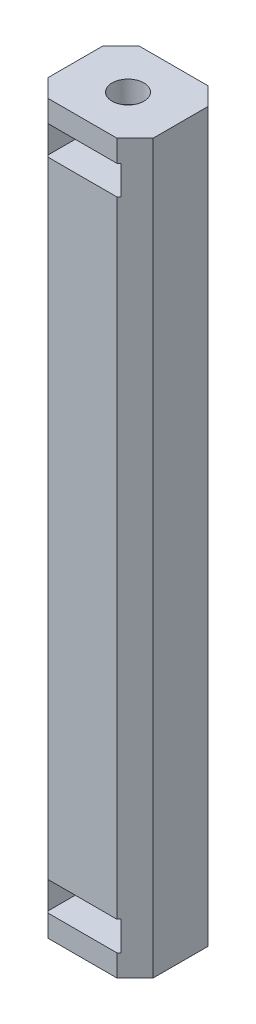
ISO-10303-21;
HEADER;
FILE_DESCRIPTION(('STEP AP214'),'2;1');
FILE_NAME('part.step','',(''),(''),'','','');
FILE_SCHEMA(('AUTOMOTIVE_DESIGN { 1 0 10303 214 1 1 1 1 }'));
ENDSEC;
DATA;
#1=APPLICATION_CONTEXT('core data for automotive mechanical design processes');
#2=APPLICATION_PROTOCOL_DEFINITION('international standard','automotive_design',2000,#1);
#3=PRODUCT_CONTEXT('',#1,'mechanical');
#4=PRODUCT('Part','Part','',(#3));
#5=PRODUCT_RELATED_PRODUCT_CATEGORY('part','',(#4));
#6=PRODUCT_DEFINITION_FORMATION('','',#4);
#7=PRODUCT_DEFINITION_CONTEXT('part definition',#1,'design');
#8=PRODUCT_DEFINITION('design','',#6,#7);
#9=PRODUCT_DEFINITION_SHAPE('','',#8);
#10=(LENGTH_UNIT() NAMED_UNIT(*) SI_UNIT(.MILLI.,.METRE.));
#11=(NAMED_UNIT(*) PLANE_ANGLE_UNIT() SI_UNIT($,.RADIAN.));
#12=(NAMED_UNIT(*) SI_UNIT($,.STERADIAN.) SOLID_ANGLE_UNIT());
#13=UNCERTAINTY_MEASURE_WITH_UNIT(LENGTH_MEASURE(1.E-05),#10,'distance_accuracy_value','');
#14=(GEOMETRIC_REPRESENTATION_CONTEXT(3) GLOBAL_UNCERTAINTY_ASSIGNED_CONTEXT((#13)) GLOBAL_UNIT_ASSIGNED_CONTEXT((#10,
#11,#12)) REPRESENTATION_CONTEXT('',''));
#15=CARTESIAN_POINT('',(0.,0.,0.));
#16=DIRECTION('',(0.,0.,1.));
#17=DIRECTION('',(1.,0.,0.));
#18=AXIS2_PLACEMENT_3D('',#15,#16,#17);
#19=CARTESIAN_POINT('',(-2.88675134594812,40.,2.5));
#20=DIRECTION('',(0.,0.,-1.));
#21=DIRECTION('',(-1.,0.,0.));
#22=AXIS2_PLACEMENT_3D('',#19,#20,#21);
#23=PLANE('',#22);
#24=DIRECTION('',(1.,0.,0.));
#25=VECTOR('',#24,1.);
#26=CARTESIAN_POINT('',(-2.88675134594812,40.,2.5));
#27=LINE('',#26,#25);
#28=CARTESIAN_POINT('',(-1.88675134594812,40.,2.5));
#29=VERTEX_POINT('',#28);
#30=CARTESIAN_POINT('',(1.88675134594812,40.,2.49999999999998));
#31=VERTEX_POINT('',#30);
#32=EDGE_CURVE('E289',#29,#31,#27,.T.);
#33=ORIENTED_EDGE('',*,*,#32,.F.);
#34=DIRECTION('',(0.,-1.,0.));
#35=VECTOR('',#34,1.);
#36=CARTESIAN_POINT('',(-1.88675134594812,40.,2.5));
#37=LINE('',#36,#35);
#38=CARTESIAN_POINT('',(-1.88675134594812,38.8,2.5));
#39=VERTEX_POINT('',#38);
#40=EDGE_CURVE('E320',#29,#39,#37,.T.);
#41=ORIENTED_EDGE('',*,*,#40,.T.);
#42=DIRECTION('',(1.,0.,0.));
#43=VECTOR('',#42,1.);
#44=CARTESIAN_POINT('',(-2.,38.8,2.5));
#45=LINE('',#44,#43);
#46=CARTESIAN_POINT('',(1.88675134594812,38.8,2.49999999999998));
#47=VERTEX_POINT('',#46);
#48=EDGE_CURVE('E227',#39,#47,#45,.T.);
#49=ORIENTED_EDGE('',*,*,#48,.T.);
#50=DIRECTION('',(0.,1.,0.));
#51=VECTOR('',#50,1.);
#52=CARTESIAN_POINT('',(1.88675134594812,40.,2.49999999999998));
#53=LINE('',#52,#51);
#54=EDGE_CURVE('E293',#47,#31,#53,.T.);
#55=ORIENTED_EDGE('',*,*,#54,.T.);
#56=EDGE_LOOP('',(#33,#41,#49,#55));
#57=FACE_BOUND('',#56,.T.);
#58=ADVANCED_FACE('F35',(#57),#23,.F.);
#59=DIRECTION('',(1.,0.,0.));
#60=VECTOR('',#59,1.);
#61=CARTESIAN_POINT('',(-2.,37.2,2.5));
#62=LINE('',#61,#60);
#63=CARTESIAN_POINT('',(-1.88675134594812,37.2,2.5));
#64=VERTEX_POINT('',#63);
#65=CARTESIAN_POINT('',(1.88675134594812,37.2,2.49999999999998));
#66=VERTEX_POINT('',#65);
#67=EDGE_CURVE('E208',#64,#66,#62,.T.);
#68=ORIENTED_EDGE('',*,*,#67,.F.);
#69=DIRECTION('',(0.,-1.,0.));
#70=VECTOR('',#69,1.);
#71=CARTESIAN_POINT('',(-1.88675134594812,40.,2.5));
#72=LINE('',#71,#70);
#73=CARTESIAN_POINT('',(-1.88675134594812,2.8,2.5));
#74=VERTEX_POINT('',#73);
#75=EDGE_CURVE('E318',#64,#74,#72,.T.);
#76=ORIENTED_EDGE('',*,*,#75,.T.);
#77=DIRECTION('',(-1.,0.,0.));
#78=VECTOR('',#77,1.);
#79=CARTESIAN_POINT('',(2.,2.8,2.49999999999998));
#80=LINE('',#79,#78);
#81=CARTESIAN_POINT('',(1.88675134594812,2.8,2.49999999999998));
#82=VERTEX_POINT('',#81);
#83=EDGE_CURVE('E246',#82,#74,#80,.T.);
#84=ORIENTED_EDGE('',*,*,#83,.F.);
#85=DIRECTION('',(0.,1.,0.));
#86=VECTOR('',#85,1.);
#87=CARTESIAN_POINT('',(1.88675134594812,40.,2.49999999999998));
#88=LINE('',#87,#86);
#89=EDGE_CURVE('E312',#82,#66,#88,.T.);
#90=ORIENTED_EDGE('',*,*,#89,.T.);
#91=EDGE_LOOP('',(#68,#76,#84,#90));
#92=FACE_BOUND('',#91,.T.);
#93=ADVANCED_FACE('F385',(#92),#23,.F.);
#94=CARTESIAN_POINT('',(0.,40.,0.));
#95=DIRECTION('',(0.,1.,0.));
#96=DIRECTION('',(0.,0.,1.));
#97=AXIS2_PLACEMENT_3D('',#94,#95,#96);
#98=CYLINDRICAL_SURFACE('',#97,0.874999999999985);
#99=CARTESIAN_POINT('',(0.,40.,0.));
#100=DIRECTION('',(0.,1.,0.));
#101=DIRECTION('',(0.,0.,1.));
#102=AXIS2_PLACEMENT_3D('',#99,#100,#101);
#103=CIRCLE('',#102,0.874999999999987);
#104=CARTESIAN_POINT('',(0.,40.,0.874999999999987));
#105=VERTEX_POINT('',#104);
#106=EDGE_CURVE('E274',#105,#105,#103,.T.);
#107=ORIENTED_EDGE('',*,*,#106,.T.);
#108=EDGE_LOOP('',(#107));
#109=FACE_BOUND('',#108,.T.);
#110=CARTESIAN_POINT('',(0.,38.8,0.));
#111=DIRECTION('',(0.,-1.,0.));
#112=DIRECTION('',(0.,0.,-1.));
#113=AXIS2_PLACEMENT_3D('',#110,#111,#112);
#114=CIRCLE('',#113,0.874999999999985);
#115=CARTESIAN_POINT('',(0.,38.8,-0.874999999999985));
#116=VERTEX_POINT('',#115);
#117=EDGE_CURVE('E234',#116,#116,#114,.F.);
#118=ORIENTED_EDGE('',*,*,#117,.F.);
#119=EDGE_LOOP('',(#118));
#120=FACE_BOUND('',#119,.T.);
#121=ADVANCED_FACE('F435',(#109,#120),#98,.F.);
#122=DIRECTION('',(-1.,0.,0.));
#123=VECTOR('',#122,1.);
#124=CARTESIAN_POINT('',(2.,1.2,2.49999999999998));
#125=LINE('',#124,#123);
#126=CARTESIAN_POINT('',(1.88675134594812,1.2,2.49999999999998));
#127=VERTEX_POINT('',#126);
#128=CARTESIAN_POINT('',(-1.88675134594812,1.2,2.5));
#129=VERTEX_POINT('',#128);
#130=EDGE_CURVE('E262',#127,#129,#125,.T.);
#131=ORIENTED_EDGE('',*,*,#130,.T.);
#132=DIRECTION('',(0.,-1.,0.));
#133=VECTOR('',#132,1.);
#134=CARTESIAN_POINT('',(-1.88675134594812,40.,2.5));
#135=LINE('',#134,#133);
#136=CARTESIAN_POINT('',(-1.88675134594812,0.,2.5));
#137=VERTEX_POINT('',#136);
#138=EDGE_CURVE('E316',#129,#137,#135,.T.);
#139=ORIENTED_EDGE('',*,*,#138,.T.);
#140=DIRECTION('',(1.,0.,0.));
#141=VECTOR('',#140,1.);
#142=CARTESIAN_POINT('',(-2.88675134594812,0.,2.5));
#143=LINE('',#142,#141);
#144=CARTESIAN_POINT('',(1.88675134594812,0.,2.49999999999998));
#145=VERTEX_POINT('',#144);
#146=EDGE_CURVE('E299',#137,#145,#143,.T.);
#147=ORIENTED_EDGE('',*,*,#146,.T.);
#148=DIRECTION('',(0.,1.,0.));
#149=VECTOR('',#148,1.);
#150=CARTESIAN_POINT('',(1.88675134594812,40.,2.49999999999998));
#151=LINE('',#150,#149);
#152=EDGE_CURVE('E314',#145,#127,#151,.T.);
#153=ORIENTED_EDGE('',*,*,#152,.T.);
#154=EDGE_LOOP('',(#131,#139,#147,#153));
#155=FACE_BOUND('',#154,.T.);
#156=ADVANCED_FACE('F410',(#155),#23,.F.);
#157=CARTESIAN_POINT('',(0.,37.2,0.));
#158=DIRECTION('',(0.,-1.,0.));
#159=DIRECTION('',(0.,0.,-1.));
#160=AXIS2_PLACEMENT_3D('',#157,#158,#159);
#161=CIRCLE('',#160,0.874999999999985);
#162=CARTESIAN_POINT('',(0.,37.2,-0.874999999999985));
#163=VERTEX_POINT('',#162);
#164=EDGE_CURVE('E256',#163,#163,#161,.F.);
#165=ORIENTED_EDGE('',*,*,#164,.T.);
#166=EDGE_LOOP('',(#165));
#167=FACE_BOUND('',#166,.T.);
#168=CARTESIAN_POINT('',(0.,2.8,0.));
#169=DIRECTION('',(0.,-1.,0.));
#170=DIRECTION('',(0.,0.,-1.));
#171=AXIS2_PLACEMENT_3D('',#168,#169,#170);
#172=CIRCLE('',#171,0.874999999999985);
#173=CARTESIAN_POINT('',(0.,2.8,-0.874999999999985));
#174=VERTEX_POINT('',#173);
#175=EDGE_CURVE('E278',#174,#174,#172,.F.);
#176=ORIENTED_EDGE('',*,*,#175,.F.);
#177=EDGE_LOOP('',(#176));
#178=FACE_BOUND('',#177,.T.);
#179=ADVANCED_FACE('F440',(#167,#178),#98,.F.);
#180=CARTESIAN_POINT('',(2.88675134594812,40.,-2.49999999999999));
#181=DIRECTION('',(0.,0.,1.));
#182=DIRECTION('',(1.,0.,0.));
#183=AXIS2_PLACEMENT_3D('',#180,#181,#182);
#184=PLANE('',#183);
#185=DIRECTION('',(-1.,0.,0.));
#186=VECTOR('',#185,1.);
#187=CARTESIAN_POINT('',(2.88675134594812,0.,-2.49999999999999));
#188=LINE('',#187,#186);
#189=CARTESIAN_POINT('',(1.88675134594812,0.,-2.49999999999999));
#190=VERTEX_POINT('',#189);
#191=CARTESIAN_POINT('',(-1.88675134594811,0.,-2.49999999999999));
#192=VERTEX_POINT('',#191);
#193=EDGE_CURVE('E281',#190,#192,#188,.T.);
#194=ORIENTED_EDGE('',*,*,#193,.T.);
#195=DIRECTION('',(0.,1.,0.));
#196=VECTOR('',#195,1.);
#197=CARTESIAN_POINT('',(-1.88675134594811,40.,-2.49999999999999));
#198=LINE('',#197,#196);
#199=CARTESIAN_POINT('',(-1.88675134594811,40.,-2.49999999999999));
#200=VERTEX_POINT('',#199);
#201=EDGE_CURVE('E365',#192,#200,#198,.T.);
#202=ORIENTED_EDGE('',*,*,#201,.T.);
#203=DIRECTION('',(-1.,0.,0.));
#204=VECTOR('',#203,1.);
#205=CARTESIAN_POINT('',(2.88675134594812,40.,-2.49999999999999));
#206=LINE('',#205,#204);
#207=CARTESIAN_POINT('',(1.88675134594812,40.,-2.49999999999999));
#208=VERTEX_POINT('',#207);
#209=EDGE_CURVE('E282',#208,#200,#206,.T.);
#210=ORIENTED_EDGE('',*,*,#209,.F.);
#211=DIRECTION('',(0.,-1.,0.));
#212=VECTOR('',#211,1.);
#213=CARTESIAN_POINT('',(1.88675134594812,40.,-2.49999999999999));
#214=LINE('',#213,#212);
#215=EDGE_CURVE('E362',#208,#190,#214,.T.);
#216=ORIENTED_EDGE('',*,*,#215,.T.);
#217=EDGE_LOOP('',(#194,#202,#210,#216));
#218=FACE_BOUND('',#217,.T.);
#219=ADVANCED_FACE('F445',(#218),#184,.F.);
#220=CARTESIAN_POINT('',(-2.88675134594812,40.,-2.49999999999998));
#221=DIRECTION('',(1.,0.,0.));
#222=DIRECTION('',(0.,0.,-1.));
#223=AXIS2_PLACEMENT_3D('',#220,#221,#222);
#224=PLANE('',#223);
#225=DIRECTION('',(0.,0.,1.));
#226=VECTOR('',#225,1.);
#227=CARTESIAN_POINT('',(-2.88675134594812,0.,-2.49999999999998));
#228=LINE('',#227,#226);
#229=CARTESIAN_POINT('',(-2.88675134594812,0.,-1.49999999999998));
#230=VERTEX_POINT('',#229);
#231=CARTESIAN_POINT('',(-2.88675134594812,0.,1.5));
#232=VERTEX_POINT('',#231);
#233=EDGE_CURVE('E296',#230,#232,#228,.T.);
#234=ORIENTED_EDGE('',*,*,#233,.T.);
#235=DIRECTION('',(0.,1.,0.));
#236=VECTOR('',#235,1.);
#237=CARTESIAN_POINT('',(-2.88675134594812,40.,1.5));
#238=LINE('',#237,#236);
#239=CARTESIAN_POINT('',(-2.88675134594812,40.,1.5));
#240=VERTEX_POINT('',#239);
#241=EDGE_CURVE('E353',#232,#240,#238,.T.);
#242=ORIENTED_EDGE('',*,*,#241,.T.);
#243=DIRECTION('',(0.,0.,1.));
#244=VECTOR('',#243,1.);
#245=CARTESIAN_POINT('',(-2.88675134594812,40.,-2.49999999999998));
#246=LINE('',#245,#244);
#247=CARTESIAN_POINT('',(-2.88675134594812,40.,-1.49999999999998));
#248=VERTEX_POINT('',#247);
#249=EDGE_CURVE('E285',#248,#240,#246,.T.);
#250=ORIENTED_EDGE('',*,*,#249,.F.);
#251=DIRECTION('',(0.,-1.,0.));
#252=VECTOR('',#251,1.);
#253=CARTESIAN_POINT('',(-2.88675134594812,40.,-1.49999999999998));
#254=LINE('',#253,#252);
#255=EDGE_CURVE('E350',#248,#230,#254,.T.);
#256=ORIENTED_EDGE('',*,*,#255,.T.);
#257=EDGE_LOOP('',(#234,#242,#250,#256));
#258=FACE_BOUND('',#257,.T.);
#259=ADVANCED_FACE('F474',(#258),#224,.F.);
#260=CARTESIAN_POINT('',(2.88675134594812,40.,-2.49999999999999));
#261=DIRECTION('',(-1.,0.,0.));
#262=DIRECTION('',(0.,0.,1.));
#263=AXIS2_PLACEMENT_3D('',#260,#261,#262);
#264=PLANE('',#263);
#265=DIRECTION('',(0.,0.,-1.));
#266=VECTOR('',#265,1.);
#267=CARTESIAN_POINT('',(2.88675134594812,0.,-2.49999999999999));
#268=LINE('',#267,#266);
#269=CARTESIAN_POINT('',(2.88675134594812,0.,1.49999999999997));
#270=VERTEX_POINT('',#269);
#271=CARTESIAN_POINT('',(2.88675134594812,0.,-1.5));
#272=VERTEX_POINT('',#271);
#273=EDGE_CURVE('E286',#270,#272,#268,.T.);
#274=ORIENTED_EDGE('',*,*,#273,.T.);
#275=DIRECTION('',(0.,1.,0.));
#276=VECTOR('',#275,1.);
#277=CARTESIAN_POINT('',(2.88675134594812,40.,-1.5));
#278=LINE('',#277,#276);
#279=CARTESIAN_POINT('',(2.88675134594812,40.,-1.5));
#280=VERTEX_POINT('',#279);
#281=EDGE_CURVE('E50',#272,#280,#278,.T.);
#282=ORIENTED_EDGE('',*,*,#281,.T.);
#283=DIRECTION('',(0.,0.,-1.));
#284=VECTOR('',#283,1.);
#285=CARTESIAN_POINT('',(2.88675134594812,40.,-2.49999999999999));
#286=LINE('',#285,#284);
#287=CARTESIAN_POINT('',(2.88675134594812,40.,1.49999999999997));
#288=VERTEX_POINT('',#287);
#289=EDGE_CURVE('E291',#288,#280,#286,.T.);
#290=ORIENTED_EDGE('',*,*,#289,.F.);
#291=DIRECTION('',(0.,-1.,0.));
#292=VECTOR('',#291,1.);
#293=CARTESIAN_POINT('',(2.88675134594812,40.,1.49999999999997));
#294=LINE('',#293,#292);
#295=EDGE_CURVE('E367',#288,#270,#294,.T.);
#296=ORIENTED_EDGE('',*,*,#295,.T.);
#297=EDGE_LOOP('',(#274,#282,#290,#296));
#298=FACE_BOUND('',#297,.T.);
#299=ADVANCED_FACE('F487',(#298),#264,.F.);
#300=CARTESIAN_POINT('',(0.,40.,0.));
#301=DIRECTION('',(0.,1.,0.));
#302=DIRECTION('',(0.,0.,1.));
#303=AXIS2_PLACEMENT_3D('',#300,#301,#302);
#304=PLANE('',#303);
#305=ORIENTED_EDGE('',*,*,#106,.F.);
#306=EDGE_LOOP('',(#305));
#307=FACE_BOUND('',#306,.T.);
#308=ORIENTED_EDGE('',*,*,#249,.T.);
#309=DIRECTION('',(-0.707106781186546,0.,-0.707106781186549));
#310=VECTOR('',#309,1.);
#311=CARTESIAN_POINT('',(-2.19337567297407,40.,2.19337567297406));
#312=LINE('',#311,#310);
#313=EDGE_CURVE('E360',#240,#29,#312,.F.);
#314=ORIENTED_EDGE('',*,*,#313,.T.);
#315=ORIENTED_EDGE('',*,*,#32,.T.);
#316=DIRECTION('',(-0.707106781186545,0.,0.70710678118655));
#317=VECTOR('',#316,1.);
#318=CARTESIAN_POINT('',(2.19337567297406,40.,2.19337567297404));
#319=LINE('',#318,#317);
#320=EDGE_CURVE('E57',#31,#288,#319,.F.);
#321=ORIENTED_EDGE('',*,*,#320,.T.);
#322=ORIENTED_EDGE('',*,*,#289,.T.);
#323=DIRECTION('',(0.707106781186546,0.,0.707106781186549));
#324=VECTOR('',#323,1.);
#325=CARTESIAN_POINT('',(2.19337567297406,40.,-2.19337567297405));
#326=LINE('',#325,#324);
#327=EDGE_CURVE('E356',#280,#208,#326,.F.);
#328=ORIENTED_EDGE('',*,*,#327,.T.);
#329=ORIENTED_EDGE('',*,*,#209,.T.);
#330=DIRECTION('',(0.707106781186548,0.,-0.707106781186548));
#331=VECTOR('',#330,1.);
#332=CARTESIAN_POINT('',(-2.19337567297405,40.,-2.19337567297405));
#333=LINE('',#332,#331);
#334=EDGE_CURVE('E358',#200,#248,#333,.F.);
#335=ORIENTED_EDGE('',*,*,#334,.T.);
#336=EDGE_LOOP('',(#308,#314,#315,#321,#322,#328,#329,#335));
#337=FACE_BOUND('',#336,.T.);
#338=ADVANCED_FACE('F461',(#307,#337),#304,.T.);
#339=CARTESIAN_POINT('',(0.,0.,0.));
#340=DIRECTION('',(0.,1.,0.));
#341=DIRECTION('',(0.,0.,1.));
#342=AXIS2_PLACEMENT_3D('',#339,#340,#341);
#343=PLANE('',#342);
#344=CARTESIAN_POINT('',(0.,0.,0.));
#345=DIRECTION('',(0.,1.,0.));
#346=DIRECTION('',(0.,0.,1.));
#347=AXIS2_PLACEMENT_3D('',#344,#345,#346);
#348=CIRCLE('',#347,0.874999999999983);
#349=CARTESIAN_POINT('',(0.,0.,0.874999999999983));
#350=VERTEX_POINT('',#349);
#351=EDGE_CURVE('E277',#350,#350,#348,.T.);
#352=ORIENTED_EDGE('',*,*,#351,.T.);
#353=EDGE_LOOP('',(#352));
#354=FACE_BOUND('',#353,.T.);
#355=ORIENTED_EDGE('',*,*,#146,.F.);
#356=DIRECTION('',(0.707106781186546,0.,0.707106781186549));
#357=VECTOR('',#356,1.);
#358=CARTESIAN_POINT('',(-1.88675134594812,0.,2.5));
#359=LINE('',#358,#357);
#360=EDGE_CURVE('E348',#137,#232,#359,.F.);
#361=ORIENTED_EDGE('',*,*,#360,.T.);
#362=ORIENTED_EDGE('',*,*,#233,.F.);
#363=DIRECTION('',(-0.707106781186548,0.,0.707106781186548));
#364=VECTOR('',#363,1.);
#365=CARTESIAN_POINT('',(-2.88675134594812,0.,-1.49999999999998));
#366=LINE('',#365,#364);
#367=EDGE_CURVE('E346',#230,#192,#366,.F.);
#368=ORIENTED_EDGE('',*,*,#367,.T.);
#369=ORIENTED_EDGE('',*,*,#193,.F.);
#370=DIRECTION('',(-0.707106781186546,0.,-0.707106781186549));
#371=VECTOR('',#370,1.);
#372=CARTESIAN_POINT('',(1.88675134594812,0.,-2.49999999999999));
#373=LINE('',#372,#371);
#374=EDGE_CURVE('E344',#190,#272,#373,.F.);
#375=ORIENTED_EDGE('',*,*,#374,.T.);
#376=ORIENTED_EDGE('',*,*,#273,.F.);
#377=DIRECTION('',(0.707106781186545,0.,-0.70710678118655));
#378=VECTOR('',#377,1.);
#379=CARTESIAN_POINT('',(2.88675134594812,0.,1.49999999999997));
#380=LINE('',#379,#378);
#381=EDGE_CURVE('E342',#270,#145,#380,.F.);
#382=ORIENTED_EDGE('',*,*,#381,.T.);
#383=EDGE_LOOP('',(#355,#361,#362,#368,#369,#375,#376,#382));
#384=FACE_BOUND('',#383,.T.);
#385=ADVANCED_FACE('F454',(#354,#384),#343,.F.);
#386=CARTESIAN_POINT('',(0.,1.2,0.));
#387=DIRECTION('',(0.,-1.,0.));
#388=DIRECTION('',(0.,0.,-1.));
#389=AXIS2_PLACEMENT_3D('',#386,#387,#388);
#390=CIRCLE('',#389,0.874999999999985);
#391=CARTESIAN_POINT('',(0.,1.2,-0.874999999999985));
#392=VERTEX_POINT('',#391);
#393=EDGE_CURVE('E269',#392,#392,#390,.F.);
#394=ORIENTED_EDGE('',*,*,#393,.T.);
#395=EDGE_LOOP('',(#394));
#396=FACE_BOUND('',#395,.T.);
#397=ORIENTED_EDGE('',*,*,#351,.F.);
#398=EDGE_LOOP('',(#397));
#399=FACE_BOUND('',#398,.T.);
#400=ADVANCED_FACE('F447',(#396,#399),#98,.F.);
#401=CARTESIAN_POINT('',(0.,2.8,0.));
#402=DIRECTION('',(0.,-1.,0.));
#403=DIRECTION('',(0.,0.,-1.));
#404=AXIS2_PLACEMENT_3D('',#401,#402,#403);
#405=PLANE('',#404);
#406=ORIENTED_EDGE('',*,*,#83,.T.);
#407=DIRECTION('',(0.707106781186546,0.,0.707106781186549));
#408=VECTOR('',#407,1.);
#409=CARTESIAN_POINT('',(-2.19337567297407,2.8,2.19337567297406));
#410=LINE('',#409,#408);
#411=CARTESIAN_POINT('',(-2.,2.8,2.38675134594812));
#412=VERTEX_POINT('',#411);
#413=EDGE_CURVE('E334',#74,#412,#410,.F.);
#414=ORIENTED_EDGE('',*,*,#413,.T.);
#415=DIRECTION('',(0.,0.,-1.));
#416=VECTOR('',#415,1.);
#417=CARTESIAN_POINT('',(-2.,2.8,2.5));
#418=LINE('',#417,#416);
#419=CARTESIAN_POINT('',(-2.,2.8,-1.15470053837925));
#420=VERTEX_POINT('',#419);
#421=EDGE_CURVE('E249',#412,#420,#418,.T.);
#422=ORIENTED_EDGE('',*,*,#421,.T.);
#423=DIRECTION('',(0.866025403784438,0.,-0.5));
#424=VECTOR('',#423,1.);
#425=CARTESIAN_POINT('',(-2.,2.8,-1.15470053837925));
#426=LINE('',#425,#424);
#427=CARTESIAN_POINT('',(0.,2.8,-2.30940107675851));
#428=VERTEX_POINT('',#427);
#429=EDGE_CURVE('E236',#420,#428,#426,.T.);
#430=ORIENTED_EDGE('',*,*,#429,.T.);
#431=DIRECTION('',(0.866025403784438,0.,0.5));
#432=VECTOR('',#431,1.);
#433=CARTESIAN_POINT('',(0.,2.8,-2.30940107675851));
#434=LINE('',#433,#432);
#435=CARTESIAN_POINT('',(2.,2.8,-1.15470053837925));
#436=VERTEX_POINT('',#435);
#437=EDGE_CURVE('E239',#428,#436,#434,.T.);
#438=ORIENTED_EDGE('',*,*,#437,.T.);
#439=DIRECTION('',(0.,0.,1.));
#440=VECTOR('',#439,1.);
#441=CARTESIAN_POINT('',(2.,2.8,-1.15470053837925));
#442=LINE('',#441,#440);
#443=CARTESIAN_POINT('',(2.,2.8,2.3867513459481));
#444=VERTEX_POINT('',#443);
#445=EDGE_CURVE('E243',#436,#444,#442,.T.);
#446=ORIENTED_EDGE('',*,*,#445,.T.);
#447=DIRECTION('',(0.707106781186545,0.,-0.70710678118655));
#448=VECTOR('',#447,1.);
#449=CARTESIAN_POINT('',(2.19337567297406,2.8,2.19337567297404));
#450=LINE('',#449,#448);
#451=EDGE_CURVE('E332',#444,#82,#450,.F.);
#452=ORIENTED_EDGE('',*,*,#451,.T.);
#453=EDGE_LOOP('',(#406,#414,#422,#430,#438,#446,#452));
#454=FACE_BOUND('',#453,.T.);
#455=ORIENTED_EDGE('',*,*,#175,.T.);
#456=EDGE_LOOP('',(#455));
#457=FACE_BOUND('',#456,.T.);
#458=ADVANCED_FACE('F378',(#454,#457),#405,.T.);
#459=CARTESIAN_POINT('',(0.,1.2,0.));
#460=DIRECTION('',(0.,-1.,0.));
#461=DIRECTION('',(0.,0.,-1.));
#462=AXIS2_PLACEMENT_3D('',#459,#460,#461);
#463=PLANE('',#462);
#464=DIRECTION('',(0.,0.,-1.));
#465=VECTOR('',#464,1.);
#466=CARTESIAN_POINT('',(-2.,1.2,1.15470053837925));
#467=LINE('',#466,#465);
#468=CARTESIAN_POINT('',(-2.,1.2,2.38675134594812));
#469=VERTEX_POINT('',#468);
#470=CARTESIAN_POINT('',(-2.,1.2,-1.15470053837925));
#471=VERTEX_POINT('',#470);
#472=EDGE_CURVE('E240',#469,#471,#467,.T.);
#473=ORIENTED_EDGE('',*,*,#472,.F.);
#474=DIRECTION('',(-0.707106781186546,0.,-0.707106781186549));
#475=VECTOR('',#474,1.);
#476=CARTESIAN_POINT('',(-1.88675134594812,1.2,2.5));
#477=LINE('',#476,#475);
#478=EDGE_CURVE('E340',#469,#129,#477,.F.);
#479=ORIENTED_EDGE('',*,*,#478,.T.);
#480=ORIENTED_EDGE('',*,*,#130,.F.);
#481=DIRECTION('',(-0.707106781186545,0.,0.70710678118655));
#482=VECTOR('',#481,1.);
#483=CARTESIAN_POINT('',(2.88675134594812,1.2,1.49999999999997));
#484=LINE('',#483,#482);
#485=CARTESIAN_POINT('',(2.,1.2,2.3867513459481));
#486=VERTEX_POINT('',#485);
#487=EDGE_CURVE('E338',#127,#486,#484,.F.);
#488=ORIENTED_EDGE('',*,*,#487,.T.);
#489=DIRECTION('',(0.,0.,1.));
#490=VECTOR('',#489,1.);
#491=CARTESIAN_POINT('',(2.,1.2,1.15470053837925));
#492=LINE('',#491,#490);
#493=CARTESIAN_POINT('',(2.,1.2,-1.15470053837925));
#494=VERTEX_POINT('',#493);
#495=EDGE_CURVE('E259',#494,#486,#492,.T.);
#496=ORIENTED_EDGE('',*,*,#495,.F.);
#497=DIRECTION('',(0.866025403784438,0.,0.5));
#498=VECTOR('',#497,1.);
#499=CARTESIAN_POINT('',(0.,1.2,-2.30940107675851));
#500=LINE('',#499,#498);
#501=CARTESIAN_POINT('',(0.,1.2,-2.30940107675851));
#502=VERTEX_POINT('',#501);
#503=EDGE_CURVE('E255',#502,#494,#500,.T.);
#504=ORIENTED_EDGE('',*,*,#503,.F.);
#505=DIRECTION('',(0.866025403784438,0.,-0.5));
#506=VECTOR('',#505,1.);
#507=CARTESIAN_POINT('',(-2.,1.2,-1.15470053837925));
#508=LINE('',#507,#506);
#509=EDGE_CURVE('E252',#471,#502,#508,.T.);
#510=ORIENTED_EDGE('',*,*,#509,.F.);
#511=EDGE_LOOP('',(#473,#479,#480,#488,#496,#504,#510));
#512=FACE_BOUND('',#511,.T.);
#513=ORIENTED_EDGE('',*,*,#393,.F.);
#514=EDGE_LOOP('',(#513));
#515=FACE_BOUND('',#514,.T.);
#516=ADVANCED_FACE('F406',(#512,#515),#463,.F.);
#517=CARTESIAN_POINT('',(-2.,2.8,-1.15470053837925));
#518=DIRECTION('',(-0.5,0.,-0.866025403784438));
#519=DIRECTION('',(-0.866025403784439,0.,0.5));
#520=AXIS2_PLACEMENT_3D('',#517,#518,#519);
#521=PLANE('',#520);
#522=ORIENTED_EDGE('',*,*,#509,.T.);
#523=DIRECTION('',(0.,-1.,0.));
#524=VECTOR('',#523,1.);
#525=CARTESIAN_POINT('',(0.,2.8,-2.30940107675851));
#526=LINE('',#525,#524);
#527=EDGE_CURVE('E251',#428,#502,#526,.T.);
#528=ORIENTED_EDGE('',*,*,#527,.F.);
#529=ORIENTED_EDGE('',*,*,#429,.F.);
#530=DIRECTION('',(0.,-1.,0.));
#531=VECTOR('',#530,1.);
#532=CARTESIAN_POINT('',(-2.,2.8,-1.15470053837925));
#533=LINE('',#532,#531);
#534=EDGE_CURVE('E266',#420,#471,#533,.T.);
#535=ORIENTED_EDGE('',*,*,#534,.T.);
#536=EDGE_LOOP('',(#522,#528,#529,#535));
#537=FACE_BOUND('',#536,.T.);
#538=ADVANCED_FACE('F418',(#537),#521,.F.);
#539=CARTESIAN_POINT('',(-2.,2.8,1.15470053837925));
#540=DIRECTION('',(-1.,0.,0.));
#541=DIRECTION('',(0.,0.,1.));
#542=AXIS2_PLACEMENT_3D('',#539,#540,#541);
#543=PLANE('',#542);
#544=ORIENTED_EDGE('',*,*,#421,.F.);
#545=DIRECTION('',(0.,1.,0.));
#546=VECTOR('',#545,1.);
#547=CARTESIAN_POINT('',(-2.,40.,2.38675134594812));
#548=LINE('',#547,#546);
#549=EDGE_CURVE('E336',#412,#469,#548,.F.);
#550=ORIENTED_EDGE('',*,*,#549,.T.);
#551=ORIENTED_EDGE('',*,*,#472,.T.);
#552=ORIENTED_EDGE('',*,*,#534,.F.);
#553=EDGE_LOOP('',(#544,#550,#551,#552));
#554=FACE_BOUND('',#553,.T.);
#555=ADVANCED_FACE('F398',(#554),#543,.F.);
#556=CARTESIAN_POINT('',(2.,2.8,1.15470053837925));
#557=DIRECTION('',(1.,0.,0.));
#558=DIRECTION('',(0.,0.,-1.));
#559=AXIS2_PLACEMENT_3D('',#556,#557,#558);
#560=PLANE('',#559);
#561=ORIENTED_EDGE('',*,*,#495,.T.);
#562=DIRECTION('',(0.,-1.,0.));
#563=VECTOR('',#562,1.);
#564=CARTESIAN_POINT('',(2.,40.,2.3867513459481));
#565=LINE('',#564,#563);
#566=EDGE_CURVE('E43',#486,#444,#565,.F.);
#567=ORIENTED_EDGE('',*,*,#566,.T.);
#568=ORIENTED_EDGE('',*,*,#445,.F.);
#569=DIRECTION('',(0.,-1.,0.));
#570=VECTOR('',#569,1.);
#571=CARTESIAN_POINT('',(2.,2.8,-1.15470053837925));
#572=LINE('',#571,#570);
#573=EDGE_CURVE('E270',#436,#494,#572,.T.);
#574=ORIENTED_EDGE('',*,*,#573,.T.);
#575=EDGE_LOOP('',(#561,#567,#568,#574));
#576=FACE_BOUND('',#575,.T.);
#577=ADVANCED_FACE('F373',(#576),#560,.F.);
#578=CARTESIAN_POINT('',(0.,2.8,-2.30940107675851));
#579=DIRECTION('',(0.5,0.,-0.866025403784438));
#580=DIRECTION('',(-0.866025403784439,0.,-0.5));
#581=AXIS2_PLACEMENT_3D('',#578,#579,#580);
#582=PLANE('',#581);
#583=ORIENTED_EDGE('',*,*,#503,.T.);
#584=ORIENTED_EDGE('',*,*,#573,.F.);
#585=ORIENTED_EDGE('',*,*,#437,.F.);
#586=ORIENTED_EDGE('',*,*,#527,.T.);
#587=EDGE_LOOP('',(#583,#584,#585,#586));
#588=FACE_BOUND('',#587,.T.);
#589=ADVANCED_FACE('F416',(#588),#582,.F.);
#590=CARTESIAN_POINT('',(0.,37.2,0.));
#591=DIRECTION('',(0.,-1.,0.));
#592=DIRECTION('',(0.,0.,-1.));
#593=AXIS2_PLACEMENT_3D('',#590,#591,#592);
#594=PLANE('',#593);
#595=DIRECTION('',(0.,0.,1.));
#596=VECTOR('',#595,1.);
#597=CARTESIAN_POINT('',(-2.,37.2,-1.15470053837925));
#598=LINE('',#597,#596);
#599=CARTESIAN_POINT('',(-2.,37.2,-1.15470053837925));
#600=VERTEX_POINT('',#599);
#601=CARTESIAN_POINT('',(-2.,37.2,2.38675134594812));
#602=VERTEX_POINT('',#601);
#603=EDGE_CURVE('E214',#600,#602,#598,.T.);
#604=ORIENTED_EDGE('',*,*,#603,.T.);
#605=DIRECTION('',(-0.707106781186546,0.,-0.707106781186549));
#606=VECTOR('',#605,1.);
#607=CARTESIAN_POINT('',(-1.88675134594812,37.2,2.5));
#608=LINE('',#607,#606);
#609=EDGE_CURVE('E330',#602,#64,#608,.F.);
#610=ORIENTED_EDGE('',*,*,#609,.T.);
#611=ORIENTED_EDGE('',*,*,#67,.T.);
#612=DIRECTION('',(-0.707106781186545,0.,0.70710678118655));
#613=VECTOR('',#612,1.);
#614=CARTESIAN_POINT('',(2.88675134594812,37.2,1.49999999999997));
#615=LINE('',#614,#613);
#616=CARTESIAN_POINT('',(2.,37.2,2.3867513459481));
#617=VERTEX_POINT('',#616);
#618=EDGE_CURVE('E195',#66,#617,#615,.F.);
#619=ORIENTED_EDGE('',*,*,#618,.T.);
#620=DIRECTION('',(0.,0.,-1.));
#621=VECTOR('',#620,1.);
#622=CARTESIAN_POINT('',(2.,37.2,1.15470053837925));
#623=LINE('',#622,#621);
#624=CARTESIAN_POINT('',(2.,37.2,-1.15470053837925));
#625=VERTEX_POINT('',#624);
#626=EDGE_CURVE('E185',#617,#625,#623,.T.);
#627=ORIENTED_EDGE('',*,*,#626,.T.);
#628=DIRECTION('',(-0.866025403784438,0.,-0.5));
#629=VECTOR('',#628,1.);
#630=CARTESIAN_POINT('',(2.,37.2,-1.15470053837925));
#631=LINE('',#630,#629);
#632=CARTESIAN_POINT('',(0.,37.2,-2.30940107675851));
#633=VERTEX_POINT('',#632);
#634=EDGE_CURVE('E192',#625,#633,#631,.T.);
#635=ORIENTED_EDGE('',*,*,#634,.T.);
#636=DIRECTION('',(-0.866025403784438,0.,0.5));
#637=VECTOR('',#636,1.);
#638=CARTESIAN_POINT('',(0.,37.2,-2.30940107675851));
#639=LINE('',#638,#637);
#640=EDGE_CURVE('E212',#633,#600,#639,.T.);
#641=ORIENTED_EDGE('',*,*,#640,.T.);
#642=EDGE_LOOP('',(#604,#610,#611,#619,#627,#635,#641));
#643=FACE_BOUND('',#642,.T.);
#644=ORIENTED_EDGE('',*,*,#164,.F.);
#645=EDGE_LOOP('',(#644));
#646=FACE_BOUND('',#645,.T.);
#647=ADVANCED_FACE('F188',(#643,#646),#594,.F.);
#648=CARTESIAN_POINT('',(0.,38.8,0.));
#649=DIRECTION('',(0.,-1.,0.));
#650=DIRECTION('',(0.,0.,-1.));
#651=AXIS2_PLACEMENT_3D('',#648,#649,#650);
#652=PLANE('',#651);
#653=ORIENTED_EDGE('',*,*,#48,.F.);
#654=DIRECTION('',(0.707106781186546,0.,0.707106781186549));
#655=VECTOR('',#654,1.);
#656=CARTESIAN_POINT('',(-2.19337567297407,38.8,2.19337567297406));
#657=LINE('',#656,#655);
#658=CARTESIAN_POINT('',(-2.,38.8,2.38675134594812));
#659=VERTEX_POINT('',#658);
#660=EDGE_CURVE('E325',#39,#659,#657,.F.);
#661=ORIENTED_EDGE('',*,*,#660,.T.);
#662=DIRECTION('',(0.,0.,1.));
#663=VECTOR('',#662,1.);
#664=CARTESIAN_POINT('',(-2.,38.8,1.15470053837925));
#665=LINE('',#664,#663);
#666=CARTESIAN_POINT('',(-2.,38.8,-1.15470053837925));
#667=VERTEX_POINT('',#666);
#668=EDGE_CURVE('E224',#667,#659,#665,.T.);
#669=ORIENTED_EDGE('',*,*,#668,.F.);
#670=DIRECTION('',(-0.866025403784438,0.,0.5));
#671=VECTOR('',#670,1.);
#672=CARTESIAN_POINT('',(0.,38.8,-2.30940107675851));
#673=LINE('',#672,#671);
#674=CARTESIAN_POINT('',(0.,38.8,-2.30940107675851));
#675=VERTEX_POINT('',#674);
#676=EDGE_CURVE('E221',#675,#667,#673,.T.);
#677=ORIENTED_EDGE('',*,*,#676,.F.);
#678=DIRECTION('',(-0.866025403784438,0.,-0.5));
#679=VECTOR('',#678,1.);
#680=CARTESIAN_POINT('',(2.,38.8,-1.15470053837925));
#681=LINE('',#680,#679);
#682=CARTESIAN_POINT('',(2.,38.8,-1.15470053837925));
#683=VERTEX_POINT('',#682);
#684=EDGE_CURVE('E219',#683,#675,#681,.T.);
#685=ORIENTED_EDGE('',*,*,#684,.F.);
#686=DIRECTION('',(0.,0.,-1.));
#687=VECTOR('',#686,1.);
#688=CARTESIAN_POINT('',(2.,38.8,2.49999999999998));
#689=LINE('',#688,#687);
#690=CARTESIAN_POINT('',(2.,38.8,2.3867513459481));
#691=VERTEX_POINT('',#690);
#692=EDGE_CURVE('E198',#691,#683,#689,.T.);
#693=ORIENTED_EDGE('',*,*,#692,.F.);
#694=DIRECTION('',(0.707106781186545,0.,-0.70710678118655));
#695=VECTOR('',#694,1.);
#696=CARTESIAN_POINT('',(2.19337567297406,38.8,2.19337567297404));
#697=LINE('',#696,#695);
#698=EDGE_CURVE('E323',#691,#47,#697,.F.);
#699=ORIENTED_EDGE('',*,*,#698,.T.);
#700=EDGE_LOOP('',(#653,#661,#669,#677,#685,#693,#699));
#701=FACE_BOUND('',#700,.T.);
#702=ORIENTED_EDGE('',*,*,#117,.T.);
#703=EDGE_LOOP('',(#702));
#704=FACE_BOUND('',#703,.T.);
#705=ADVANCED_FACE('F492',(#701,#704),#652,.T.);
#706=CARTESIAN_POINT('',(2.,37.2,2.49999999999998));
#707=DIRECTION('',(1.,0.,0.));
#708=DIRECTION('',(0.,0.,-1.));
#709=AXIS2_PLACEMENT_3D('',#706,#707,#708);
#710=PLANE('',#709);
#711=ORIENTED_EDGE('',*,*,#626,.F.);
#712=DIRECTION('',(0.,-1.,0.));
#713=VECTOR('',#712,1.);
#714=CARTESIAN_POINT('',(2.,40.,2.3867513459481));
#715=LINE('',#714,#713);
#716=EDGE_CURVE('E11',#617,#691,#715,.F.);
#717=ORIENTED_EDGE('',*,*,#716,.T.);
#718=ORIENTED_EDGE('',*,*,#692,.T.);
#719=DIRECTION('',(0.,1.,0.));
#720=VECTOR('',#719,1.);
#721=CARTESIAN_POINT('',(2.,37.2,-1.15470053837925));
#722=LINE('',#721,#720);
#723=EDGE_CURVE('E201',#625,#683,#722,.T.);
#724=ORIENTED_EDGE('',*,*,#723,.F.);
#725=EDGE_LOOP('',(#711,#717,#718,#724));
#726=FACE_BOUND('',#725,.T.);
#727=ADVANCED_FACE('F202',(#726),#710,.F.);
#728=CARTESIAN_POINT('',(-2.,37.2,1.15470053837925));
#729=DIRECTION('',(-1.,0.,0.));
#730=DIRECTION('',(0.,0.,1.));
#731=AXIS2_PLACEMENT_3D('',#728,#729,#730);
#732=PLANE('',#731);
#733=ORIENTED_EDGE('',*,*,#668,.T.);
#734=DIRECTION('',(0.,1.,0.));
#735=VECTOR('',#734,1.);
#736=CARTESIAN_POINT('',(-2.,40.,2.38675134594812));
#737=LINE('',#736,#735);
#738=EDGE_CURVE('E327',#659,#602,#737,.F.);
#739=ORIENTED_EDGE('',*,*,#738,.T.);
#740=ORIENTED_EDGE('',*,*,#603,.F.);
#741=DIRECTION('',(0.,1.,0.));
#742=VECTOR('',#741,1.);
#743=CARTESIAN_POINT('',(-2.,37.2,-1.15470053837925));
#744=LINE('',#743,#742);
#745=EDGE_CURVE('E231',#600,#667,#744,.T.);
#746=ORIENTED_EDGE('',*,*,#745,.T.);
#747=EDGE_LOOP('',(#733,#739,#740,#746));
#748=FACE_BOUND('',#747,.T.);
#749=ADVANCED_FACE('F498',(#748),#732,.F.);
#750=CARTESIAN_POINT('',(0.,37.2,-2.30940107675851));
#751=DIRECTION('',(-0.5,0.,-0.866025403784438));
#752=DIRECTION('',(-0.866025403784439,0.,0.5));
#753=AXIS2_PLACEMENT_3D('',#750,#751,#752);
#754=PLANE('',#753);
#755=ORIENTED_EDGE('',*,*,#676,.T.);
#756=ORIENTED_EDGE('',*,*,#745,.F.);
#757=ORIENTED_EDGE('',*,*,#640,.F.);
#758=DIRECTION('',(0.,1.,0.));
#759=VECTOR('',#758,1.);
#760=CARTESIAN_POINT('',(0.,37.2,-2.30940107675851));
#761=LINE('',#760,#759);
#762=EDGE_CURVE('E207',#633,#675,#761,.T.);
#763=ORIENTED_EDGE('',*,*,#762,.T.);
#764=EDGE_LOOP('',(#755,#756,#757,#763));
#765=FACE_BOUND('',#764,.T.);
#766=ADVANCED_FACE('F496',(#765),#754,.F.);
#767=CARTESIAN_POINT('',(2.,37.2,-1.15470053837925));
#768=DIRECTION('',(0.5,0.,-0.866025403784438));
#769=DIRECTION('',(-0.866025403784439,0.,-0.5));
#770=AXIS2_PLACEMENT_3D('',#767,#768,#769);
#771=PLANE('',#770);
#772=ORIENTED_EDGE('',*,*,#684,.T.);
#773=ORIENTED_EDGE('',*,*,#762,.F.);
#774=ORIENTED_EDGE('',*,*,#634,.F.);
#775=ORIENTED_EDGE('',*,*,#723,.T.);
#776=EDGE_LOOP('',(#772,#773,#774,#775));
#777=FACE_BOUND('',#776,.T.);
#778=ADVANCED_FACE('F210',(#777),#771,.F.);
#779=CARTESIAN_POINT('',(-1.88675134594812,40.,2.5));
#780=DIRECTION('',(0.707106781186549,0.,-0.707106781186546));
#781=DIRECTION('',(0.,-1.,0.));
#782=AXIS2_PLACEMENT_3D('',#779,#780,#781);
#783=PLANE('',#782);
#784=ORIENTED_EDGE('',*,*,#313,.F.);
#785=ORIENTED_EDGE('',*,*,#241,.F.);
#786=ORIENTED_EDGE('',*,*,#360,.F.);
#787=ORIENTED_EDGE('',*,*,#138,.F.);
#788=ORIENTED_EDGE('',*,*,#478,.F.);
#789=ORIENTED_EDGE('',*,*,#549,.F.);
#790=ORIENTED_EDGE('',*,*,#413,.F.);
#791=ORIENTED_EDGE('',*,*,#75,.F.);
#792=ORIENTED_EDGE('',*,*,#609,.F.);
#793=ORIENTED_EDGE('',*,*,#738,.F.);
#794=ORIENTED_EDGE('',*,*,#660,.F.);
#795=ORIENTED_EDGE('',*,*,#40,.F.);
#796=EDGE_LOOP('',(#784,#785,#786,#787,#788,#789,#790,#791,#792,#793,#794,#795));
#797=FACE_BOUND('',#796,.T.);
#798=ADVANCED_FACE('F392',(#797),#783,.F.);
#799=CARTESIAN_POINT('',(-2.88675134594812,40.,-1.49999999999998));
#800=DIRECTION('',(0.707106781186548,0.,0.707106781186548));
#801=DIRECTION('',(0.,-1.,0.));
#802=AXIS2_PLACEMENT_3D('',#799,#800,#801);
#803=PLANE('',#802);
#804=ORIENTED_EDGE('',*,*,#334,.F.);
#805=ORIENTED_EDGE('',*,*,#201,.F.);
#806=ORIENTED_EDGE('',*,*,#367,.F.);
#807=ORIENTED_EDGE('',*,*,#255,.F.);
#808=EDGE_LOOP('',(#804,#805,#806,#807));
#809=FACE_BOUND('',#808,.T.);
#810=ADVANCED_FACE('F480',(#809),#803,.F.);
#811=CARTESIAN_POINT('',(1.88675134594812,40.,-2.49999999999999));
#812=DIRECTION('',(-0.707106781186549,0.,0.707106781186546));
#813=DIRECTION('',(0.,-1.,0.));
#814=AXIS2_PLACEMENT_3D('',#811,#812,#813);
#815=PLANE('',#814);
#816=ORIENTED_EDGE('',*,*,#327,.F.);
#817=ORIENTED_EDGE('',*,*,#281,.F.);
#818=ORIENTED_EDGE('',*,*,#374,.F.);
#819=ORIENTED_EDGE('',*,*,#215,.F.);
#820=EDGE_LOOP('',(#816,#817,#818,#819));
#821=FACE_BOUND('',#820,.T.);
#822=ADVANCED_FACE('F486',(#821),#815,.F.);
#823=CARTESIAN_POINT('',(2.88675134594812,40.,1.49999999999997));
#824=DIRECTION('',(-0.70710678118655,0.,-0.707106781186545));
#825=DIRECTION('',(0.,-1.,0.));
#826=AXIS2_PLACEMENT_3D('',#823,#824,#825);
#827=PLANE('',#826);
#828=ORIENTED_EDGE('',*,*,#487,.F.);
#829=ORIENTED_EDGE('',*,*,#152,.F.);
#830=ORIENTED_EDGE('',*,*,#381,.F.);
#831=ORIENTED_EDGE('',*,*,#295,.F.);
#832=ORIENTED_EDGE('',*,*,#320,.F.);
#833=ORIENTED_EDGE('',*,*,#54,.F.);
#834=ORIENTED_EDGE('',*,*,#698,.F.);
#835=ORIENTED_EDGE('',*,*,#716,.F.);
#836=ORIENTED_EDGE('',*,*,#618,.F.);
#837=ORIENTED_EDGE('',*,*,#89,.F.);
#838=ORIENTED_EDGE('',*,*,#451,.F.);
#839=ORIENTED_EDGE('',*,*,#566,.F.);
#840=EDGE_LOOP('',(#828,#829,#830,#831,#832,#833,#834,#835,#836,#837,#838,#839));
#841=FACE_BOUND('',#840,.T.);
#842=ADVANCED_FACE('F37',(#841),#827,.F.);
#843=CLOSED_SHELL('',(#58,#93,#121,#156,#179,#219,#259,#299,#338,#385,#400,#458,#516,#538,#555,
#577,#589,#647,#705,#727,#749,#766,#778,#798,#810,#822,#842));
#844=MANIFOLD_SOLID_BREP('B2',#843);
#845=ADVANCED_BREP_SHAPE_REPRESENTATION('',(#18,#844),#14);
#846=SHAPE_DEFINITION_REPRESENTATION(#9,#845);
ENDSEC;
END-ISO-10303-21;
